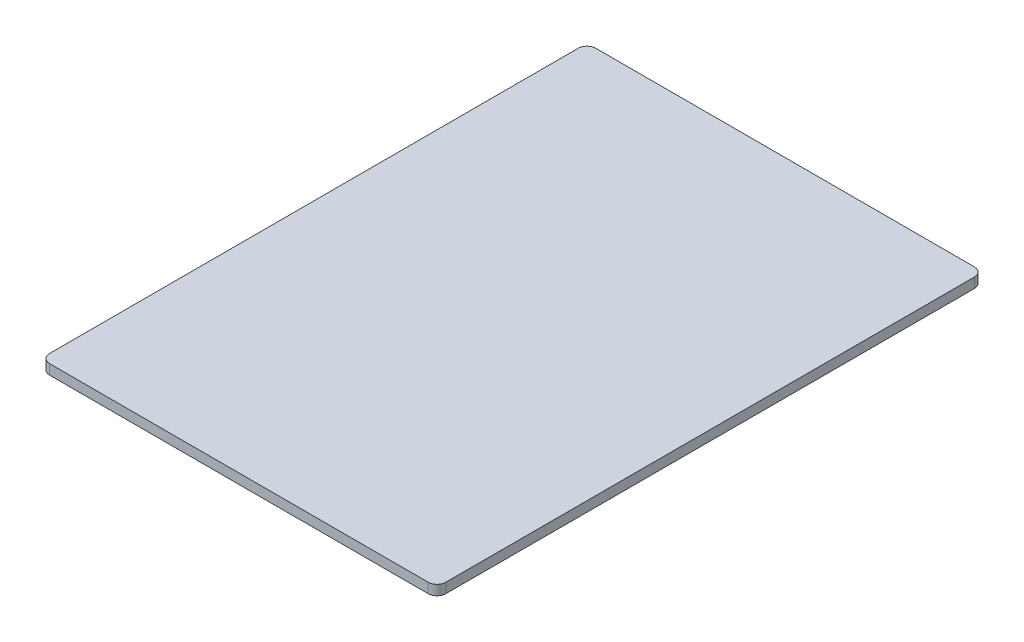
ISO-10303-21;
HEADER;
FILE_DESCRIPTION(('STEP AP214'),'2;1');
FILE_NAME('part.step','',(''),(''),'','','');
FILE_SCHEMA(('AUTOMOTIVE_DESIGN { 1 0 10303 214 1 1 1 1 }'));
ENDSEC;
DATA;
#1=APPLICATION_CONTEXT('core data for automotive mechanical design processes');
#2=APPLICATION_PROTOCOL_DEFINITION('international standard','automotive_design',2000,#1);
#3=PRODUCT_CONTEXT('',#1,'mechanical');
#4=PRODUCT('Part','Part','',(#3));
#5=PRODUCT_RELATED_PRODUCT_CATEGORY('part','',(#4));
#6=PRODUCT_DEFINITION_FORMATION('','',#4);
#7=PRODUCT_DEFINITION_CONTEXT('part definition',#1,'design');
#8=PRODUCT_DEFINITION('design','',#6,#7);
#9=PRODUCT_DEFINITION_SHAPE('','',#8);
#10=(LENGTH_UNIT() NAMED_UNIT(*) SI_UNIT(.MILLI.,.METRE.));
#11=(NAMED_UNIT(*) PLANE_ANGLE_UNIT() SI_UNIT($,.RADIAN.));
#12=(NAMED_UNIT(*) SI_UNIT($,.STERADIAN.) SOLID_ANGLE_UNIT());
#13=UNCERTAINTY_MEASURE_WITH_UNIT(LENGTH_MEASURE(1.E-05),#10,'distance_accuracy_value','');
#14=(GEOMETRIC_REPRESENTATION_CONTEXT(3) GLOBAL_UNCERTAINTY_ASSIGNED_CONTEXT((#13)) GLOBAL_UNIT_ASSIGNED_CONTEXT((#10,
#11,#12)) REPRESENTATION_CONTEXT('',''));
#15=CARTESIAN_POINT('',(0.,0.,0.));
#16=DIRECTION('',(0.,0.,1.));
#17=DIRECTION('',(1.,0.,0.));
#18=AXIS2_PLACEMENT_3D('',#15,#16,#17);
#19=CARTESIAN_POINT('',(0.,0.,0.));
#20=DIRECTION('',(0.,1.,0.));
#21=DIRECTION('',(0.,0.,1.));
#22=AXIS2_PLACEMENT_3D('',#19,#20,#21);
#23=PLANE('',#22);
#24=DIRECTION('',(1.,0.,0.));
#25=VECTOR('',#24,1.);
#26=CARTESIAN_POINT('',(-24.056923076923,0.,45.0960576923077));
#27=LINE('',#26,#25);
#28=CARTESIAN_POINT('',(-23.056923076923,0.,45.0960576923077));
#29=VERTEX_POINT('',#28);
#30=CARTESIAN_POINT('',(19.6630769230769,0.,45.0960576923077));
#31=VERTEX_POINT('',#30);
#32=EDGE_CURVE('E151',#29,#31,#27,.T.);
#33=ORIENTED_EDGE('',*,*,#32,.F.);
#34=CARTESIAN_POINT('',(-23.056923076923,0.,44.0960576923077));
#35=DIRECTION('',(0.,1.,0.));
#36=DIRECTION('',(0.,0.,1.));
#37=AXIS2_PLACEMENT_3D('',#34,#35,#36);
#38=CIRCLE('',#37,1.);
#39=CARTESIAN_POINT('',(-24.056923076923,0.,44.0960576923077));
#40=VERTEX_POINT('',#39);
#41=EDGE_CURVE('E188',#29,#40,#38,.F.);
#42=ORIENTED_EDGE('',*,*,#41,.T.);
#43=DIRECTION('',(0.,0.,1.));
#44=VECTOR('',#43,1.);
#45=CARTESIAN_POINT('',(-24.0569230769231,0.,-16.5539423076923));
#46=LINE('',#45,#44);
#47=CARTESIAN_POINT('',(-24.0569230769231,0.,-15.5539423076923));
#48=VERTEX_POINT('',#47);
#49=EDGE_CURVE('E148',#48,#40,#46,.T.);
#50=ORIENTED_EDGE('',*,*,#49,.F.);
#51=CARTESIAN_POINT('',(-23.0569230769231,0.,-15.5539423076923));
#52=DIRECTION('',(0.,1.,0.));
#53=DIRECTION('',(0.,0.,1.));
#54=AXIS2_PLACEMENT_3D('',#51,#52,#53);
#55=CIRCLE('',#54,1.);
#56=CARTESIAN_POINT('',(-23.0569230769231,0.,-16.5539423076923));
#57=VERTEX_POINT('',#56);
#58=EDGE_CURVE('E182',#48,#57,#55,.F.);
#59=ORIENTED_EDGE('',*,*,#58,.T.);
#60=DIRECTION('',(-1.,0.,0.));
#61=VECTOR('',#60,1.);
#62=CARTESIAN_POINT('',(-24.0569230769231,0.,-16.5539423076923));
#63=LINE('',#62,#61);
#64=CARTESIAN_POINT('',(19.6630769230769,0.,-16.5539423076923));
#65=VERTEX_POINT('',#64);
#66=EDGE_CURVE('E161',#65,#57,#63,.T.);
#67=ORIENTED_EDGE('',*,*,#66,.F.);
#68=CARTESIAN_POINT('',(19.6630769230769,0.,-15.5539423076923));
#69=DIRECTION('',(0.,1.,0.));
#70=DIRECTION('',(0.,0.,1.));
#71=AXIS2_PLACEMENT_3D('',#68,#69,#70);
#72=CIRCLE('',#71,1.);
#73=CARTESIAN_POINT('',(20.6630769230769,0.,-15.5539423076923));
#74=VERTEX_POINT('',#73);
#75=EDGE_CURVE('E184',#65,#74,#72,.F.);
#76=ORIENTED_EDGE('',*,*,#75,.T.);
#77=DIRECTION('',(0.,0.,-1.));
#78=VECTOR('',#77,1.);
#79=CARTESIAN_POINT('',(20.6630769230769,0.,-16.5539423076923));
#80=LINE('',#79,#78);
#81=CARTESIAN_POINT('',(20.6630769230769,0.,44.0960576923077));
#82=VERTEX_POINT('',#81);
#83=EDGE_CURVE('E173',#82,#74,#80,.T.);
#84=ORIENTED_EDGE('',*,*,#83,.F.);
#85=CARTESIAN_POINT('',(19.6630769230769,0.,44.0960576923077));
#86=DIRECTION('',(0.,1.,0.));
#87=DIRECTION('',(0.,0.,1.));
#88=AXIS2_PLACEMENT_3D('',#85,#86,#87);
#89=CIRCLE('',#88,1.);
#90=EDGE_CURVE('E186',#82,#31,#89,.F.);
#91=ORIENTED_EDGE('',*,*,#90,.T.);
#92=EDGE_LOOP('',(#33,#42,#50,#59,#67,#76,#84,#91));
#93=FACE_BOUND('',#92,.T.);
#94=DIRECTION('',(0.,0.,-1.));
#95=VECTOR('',#94,1.);
#96=CARTESIAN_POINT('',(-20.3069230769231,0.,39.5560576923077));
#97=LINE('',#96,#95);
#98=CARTESIAN_POINT('',(-20.3069230769231,0.,39.5560576923077));
#99=VERTEX_POINT('',#98);
#100=CARTESIAN_POINT('',(-20.306923076923,0.,-10.0939423076923));
#101=VERTEX_POINT('',#100);
#102=EDGE_CURVE('E54',#99,#101,#97,.T.);
#103=ORIENTED_EDGE('',*,*,#102,.F.);
#104=DIRECTION('',(-1.,0.,0.));
#105=VECTOR('',#104,1.);
#106=CARTESIAN_POINT('',(-20.3069230769231,0.,39.5560576923077));
#107=LINE('',#106,#105);
#108=CARTESIAN_POINT('',(16.9130769230769,0.,39.5560576923077));
#109=VERTEX_POINT('',#108);
#110=EDGE_CURVE('E58',#109,#99,#107,.T.);
#111=ORIENTED_EDGE('',*,*,#110,.F.);
#112=DIRECTION('',(0.,0.,1.));
#113=VECTOR('',#112,1.);
#114=CARTESIAN_POINT('',(16.9130769230769,0.,39.5560576923077));
#115=LINE('',#114,#113);
#116=CARTESIAN_POINT('',(16.9130769230769,0.,-10.0939423076923));
#117=VERTEX_POINT('',#116);
#118=EDGE_CURVE('E398',#117,#109,#115,.T.);
#119=ORIENTED_EDGE('',*,*,#118,.F.);
#120=DIRECTION('',(1.,0.,0.));
#121=VECTOR('',#120,1.);
#122=CARTESIAN_POINT('',(-20.306923076923,0.,-10.0939423076923));
#123=LINE('',#122,#121);
#124=EDGE_CURVE('E404',#101,#117,#123,.T.);
#125=ORIENTED_EDGE('',*,*,#124,.F.);
#126=EDGE_LOOP('',(#103,#111,#119,#125));
#127=FACE_BOUND('',#126,.T.);
#128=ADVANCED_FACE('F39',(#93,#127),#23,.F.);
#129=CARTESIAN_POINT('',(-24.0569230769231,1.125,-16.5539423076923));
#130=DIRECTION('',(1.,0.,0.));
#131=DIRECTION('',(0.,0.,-1.));
#132=AXIS2_PLACEMENT_3D('',#129,#130,#131);
#133=PLANE('',#132);
#134=ORIENTED_EDGE('',*,*,#49,.T.);
#135=DIRECTION('',(0.,-1.,0.));
#136=VECTOR('',#135,1.);
#137=CARTESIAN_POINT('',(-24.056923076923,1.125,44.0960576923077));
#138=LINE('',#137,#136);
#139=CARTESIAN_POINT('',(-24.056923076923,1.125,44.0960576923077));
#140=VERTEX_POINT('',#139);
#141=EDGE_CURVE('E193',#40,#140,#138,.F.);
#142=ORIENTED_EDGE('',*,*,#141,.T.);
#143=DIRECTION('',(0.,0.,1.));
#144=VECTOR('',#143,1.);
#145=CARTESIAN_POINT('',(-24.0569230769231,1.125,-16.5539423076923));
#146=LINE('',#145,#144);
#147=CARTESIAN_POINT('',(-24.0569230769231,1.125,-15.5539423076923));
#148=VERTEX_POINT('',#147);
#149=EDGE_CURVE('E157',#148,#140,#146,.T.);
#150=ORIENTED_EDGE('',*,*,#149,.F.);
#151=DIRECTION('',(0.,-1.,0.));
#152=VECTOR('',#151,1.);
#153=CARTESIAN_POINT('',(-24.0569230769231,1.125,-15.5539423076923));
#154=LINE('',#153,#152);
#155=EDGE_CURVE('E190',#148,#48,#154,.T.);
#156=ORIENTED_EDGE('',*,*,#155,.T.);
#157=EDGE_LOOP('',(#134,#142,#150,#156));
#158=FACE_BOUND('',#157,.T.);
#159=ADVANCED_FACE('F222',(#158),#133,.F.);
#160=CARTESIAN_POINT('',(-24.056923076923,1.125,45.0960576923077));
#161=DIRECTION('',(0.,0.,-1.));
#162=DIRECTION('',(-1.,0.,0.));
#163=AXIS2_PLACEMENT_3D('',#160,#161,#162);
#164=PLANE('',#163);
#165=DIRECTION('',(1.,0.,0.));
#166=VECTOR('',#165,1.);
#167=CARTESIAN_POINT('',(-24.056923076923,1.125,45.0960576923077));
#168=LINE('',#167,#166);
#169=CARTESIAN_POINT('',(-23.056923076923,1.125,45.0960576923077));
#170=VERTEX_POINT('',#169);
#171=CARTESIAN_POINT('',(19.6630769230769,1.125,45.0960576923077));
#172=VERTEX_POINT('',#171);
#173=EDGE_CURVE('E160',#170,#172,#168,.T.);
#174=ORIENTED_EDGE('',*,*,#173,.F.);
#175=DIRECTION('',(0.,-1.,0.));
#176=VECTOR('',#175,1.);
#177=CARTESIAN_POINT('',(-23.056923076923,1.125,45.0960576923077));
#178=LINE('',#177,#176);
#179=EDGE_CURVE('E179',#170,#29,#178,.T.);
#180=ORIENTED_EDGE('',*,*,#179,.T.);
#181=ORIENTED_EDGE('',*,*,#32,.T.);
#182=DIRECTION('',(0.,-1.,0.));
#183=VECTOR('',#182,1.);
#184=CARTESIAN_POINT('',(19.6630769230769,1.125,45.0960576923077));
#185=LINE('',#184,#183);
#186=EDGE_CURVE('E169',#31,#172,#185,.F.);
#187=ORIENTED_EDGE('',*,*,#186,.T.);
#188=EDGE_LOOP('',(#174,#180,#181,#187));
#189=FACE_BOUND('',#188,.T.);
#190=ADVANCED_FACE('F232',(#189),#164,.F.);
#191=CARTESIAN_POINT('',(20.6630769230769,1.125,-16.5539423076923));
#192=DIRECTION('',(-1.,0.,0.));
#193=DIRECTION('',(0.,0.,1.));
#194=AXIS2_PLACEMENT_3D('',#191,#192,#193);
#195=PLANE('',#194);
#196=DIRECTION('',(0.,0.,-1.));
#197=VECTOR('',#196,1.);
#198=CARTESIAN_POINT('',(20.6630769230769,1.125,-16.5539423076923));
#199=LINE('',#198,#197);
#200=CARTESIAN_POINT('',(20.6630769230769,1.125,44.0960576923077));
#201=VERTEX_POINT('',#200);
#202=CARTESIAN_POINT('',(20.6630769230769,1.125,-15.5539423076923));
#203=VERTEX_POINT('',#202);
#204=EDGE_CURVE('E164',#201,#203,#199,.T.);
#205=ORIENTED_EDGE('',*,*,#204,.F.);
#206=DIRECTION('',(0.,-1.,0.));
#207=VECTOR('',#206,1.);
#208=CARTESIAN_POINT('',(20.6630769230769,1.125,44.0960576923077));
#209=LINE('',#208,#207);
#210=EDGE_CURVE('E205',#201,#82,#209,.T.);
#211=ORIENTED_EDGE('',*,*,#210,.T.);
#212=ORIENTED_EDGE('',*,*,#83,.T.);
#213=DIRECTION('',(0.,-1.,0.));
#214=VECTOR('',#213,1.);
#215=CARTESIAN_POINT('',(20.6630769230769,1.125,-15.5539423076923));
#216=LINE('',#215,#214);
#217=EDGE_CURVE('E203',#74,#203,#216,.F.);
#218=ORIENTED_EDGE('',*,*,#217,.T.);
#219=EDGE_LOOP('',(#205,#211,#212,#218));
#220=FACE_BOUND('',#219,.T.);
#221=ADVANCED_FACE('F241',(#220),#195,.F.);
#222=CARTESIAN_POINT('',(-24.0569230769231,1.125,-16.5539423076923));
#223=DIRECTION('',(0.,0.,1.));
#224=DIRECTION('',(1.,0.,0.));
#225=AXIS2_PLACEMENT_3D('',#222,#223,#224);
#226=PLANE('',#225);
#227=DIRECTION('',(-1.,0.,0.));
#228=VECTOR('',#227,1.);
#229=CARTESIAN_POINT('',(-24.0569230769231,1.125,-16.5539423076923));
#230=LINE('',#229,#228);
#231=CARTESIAN_POINT('',(19.6630769230769,1.125,-16.5539423076923));
#232=VERTEX_POINT('',#231);
#233=CARTESIAN_POINT('',(-23.0569230769231,1.125,-16.5539423076923));
#234=VERTEX_POINT('',#233);
#235=EDGE_CURVE('E167',#232,#234,#230,.T.);
#236=ORIENTED_EDGE('',*,*,#235,.F.);
#237=DIRECTION('',(0.,-1.,0.));
#238=VECTOR('',#237,1.);
#239=CARTESIAN_POINT('',(19.6630769230769,1.125,-16.5539423076923));
#240=LINE('',#239,#238);
#241=EDGE_CURVE('E11',#232,#65,#240,.T.);
#242=ORIENTED_EDGE('',*,*,#241,.T.);
#243=ORIENTED_EDGE('',*,*,#66,.T.);
#244=DIRECTION('',(0.,-1.,0.));
#245=VECTOR('',#244,1.);
#246=CARTESIAN_POINT('',(-23.0569230769231,1.125,-16.5539423076923));
#247=LINE('',#246,#245);
#248=EDGE_CURVE('E47',#57,#234,#247,.F.);
#249=ORIENTED_EDGE('',*,*,#248,.T.);
#250=EDGE_LOOP('',(#236,#242,#243,#249));
#251=FACE_BOUND('',#250,.T.);
#252=ADVANCED_FACE('F210',(#251),#226,.F.);
#253=CARTESIAN_POINT('',(0.,1.125,0.));
#254=DIRECTION('',(0.,1.,0.));
#255=DIRECTION('',(0.,0.,1.));
#256=AXIS2_PLACEMENT_3D('',#253,#254,#255);
#257=PLANE('',#256);
#258=ORIENTED_EDGE('',*,*,#149,.T.);
#259=CARTESIAN_POINT('',(-23.056923076923,1.125,44.0960576923077));
#260=DIRECTION('',(0.,1.,0.));
#261=DIRECTION('',(0.,0.,1.));
#262=AXIS2_PLACEMENT_3D('',#259,#260,#261);
#263=CIRCLE('',#262,1.);
#264=EDGE_CURVE('E201',#140,#170,#263,.T.);
#265=ORIENTED_EDGE('',*,*,#264,.T.);
#266=ORIENTED_EDGE('',*,*,#173,.T.);
#267=CARTESIAN_POINT('',(19.6630769230769,1.125,44.0960576923077));
#268=DIRECTION('',(0.,1.,0.));
#269=DIRECTION('',(0.,0.,1.));
#270=AXIS2_PLACEMENT_3D('',#267,#268,#269);
#271=CIRCLE('',#270,1.);
#272=EDGE_CURVE('E199',#172,#201,#271,.T.);
#273=ORIENTED_EDGE('',*,*,#272,.T.);
#274=ORIENTED_EDGE('',*,*,#204,.T.);
#275=CARTESIAN_POINT('',(19.6630769230769,1.125,-15.5539423076923));
#276=DIRECTION('',(0.,1.,0.));
#277=DIRECTION('',(0.,0.,1.));
#278=AXIS2_PLACEMENT_3D('',#275,#276,#277);
#279=CIRCLE('',#278,1.);
#280=EDGE_CURVE('E197',#203,#232,#279,.T.);
#281=ORIENTED_EDGE('',*,*,#280,.T.);
#282=ORIENTED_EDGE('',*,*,#235,.T.);
#283=CARTESIAN_POINT('',(-23.0569230769231,1.125,-15.5539423076923));
#284=DIRECTION('',(0.,1.,0.));
#285=DIRECTION('',(0.,0.,1.));
#286=AXIS2_PLACEMENT_3D('',#283,#284,#285);
#287=CIRCLE('',#286,1.);
#288=EDGE_CURVE('E195',#234,#148,#287,.T.);
#289=ORIENTED_EDGE('',*,*,#288,.T.);
#290=EDGE_LOOP('',(#258,#265,#266,#273,#274,#281,#282,#289));
#291=FACE_BOUND('',#290,.T.);
#292=ADVANCED_FACE('F216',(#291),#257,.T.);
#293=CARTESIAN_POINT('',(-23.056923076923,1.125,44.0960576923077));
#294=DIRECTION('',(0.,-1.,0.));
#295=DIRECTION('',(0.,0.,-1.));
#296=AXIS2_PLACEMENT_3D('',#293,#294,#295);
#297=CYLINDRICAL_SURFACE('',#296,1.);
#298=ORIENTED_EDGE('',*,*,#264,.F.);
#299=ORIENTED_EDGE('',*,*,#141,.F.);
#300=ORIENTED_EDGE('',*,*,#41,.F.);
#301=ORIENTED_EDGE('',*,*,#179,.F.);
#302=EDGE_LOOP('',(#298,#299,#300,#301));
#303=FACE_BOUND('',#302,.T.);
#304=ADVANCED_FACE('F229',(#303),#297,.T.);
#305=CARTESIAN_POINT('',(19.6630769230769,1.125,44.0960576923077));
#306=DIRECTION('',(0.,-1.,0.));
#307=DIRECTION('',(0.,0.,-1.));
#308=AXIS2_PLACEMENT_3D('',#305,#306,#307);
#309=CYLINDRICAL_SURFACE('',#308,1.);
#310=ORIENTED_EDGE('',*,*,#272,.F.);
#311=ORIENTED_EDGE('',*,*,#186,.F.);
#312=ORIENTED_EDGE('',*,*,#90,.F.);
#313=ORIENTED_EDGE('',*,*,#210,.F.);
#314=EDGE_LOOP('',(#310,#311,#312,#313));
#315=FACE_BOUND('',#314,.T.);
#316=ADVANCED_FACE('F238',(#315),#309,.T.);
#317=CARTESIAN_POINT('',(19.6630769230769,1.125,-15.5539423076923));
#318=DIRECTION('',(0.,-1.,0.));
#319=DIRECTION('',(0.,0.,-1.));
#320=AXIS2_PLACEMENT_3D('',#317,#318,#319);
#321=CYLINDRICAL_SURFACE('',#320,1.);
#322=ORIENTED_EDGE('',*,*,#280,.F.);
#323=ORIENTED_EDGE('',*,*,#217,.F.);
#324=ORIENTED_EDGE('',*,*,#75,.F.);
#325=ORIENTED_EDGE('',*,*,#241,.F.);
#326=EDGE_LOOP('',(#322,#323,#324,#325));
#327=FACE_BOUND('',#326,.T.);
#328=ADVANCED_FACE('F244',(#327),#321,.T.);
#329=CARTESIAN_POINT('',(-23.0569230769231,1.125,-15.5539423076923));
#330=DIRECTION('',(0.,-1.,0.));
#331=DIRECTION('',(0.,0.,-1.));
#332=AXIS2_PLACEMENT_3D('',#329,#330,#331);
#333=CYLINDRICAL_SURFACE('',#332,1.);
#334=ORIENTED_EDGE('',*,*,#288,.F.);
#335=ORIENTED_EDGE('',*,*,#248,.F.);
#336=ORIENTED_EDGE('',*,*,#58,.F.);
#337=ORIENTED_EDGE('',*,*,#155,.F.);
#338=EDGE_LOOP('',(#334,#335,#336,#337));
#339=FACE_BOUND('',#338,.T.);
#340=ADVANCED_FACE('F41',(#339),#333,.T.);
#341=CARTESIAN_POINT('',(-20.3069230769231,-0.78,39.5560576923077));
#342=DIRECTION('',(1.,0.,0.));
#343=DIRECTION('',(0.,0.,-1.));
#344=AXIS2_PLACEMENT_3D('',#341,#342,#343);
#345=PLANE('',#344);
#346=ORIENTED_EDGE('',*,*,#102,.T.);
#347=DIRECTION('',(0.,1.,0.));
#348=VECTOR('',#347,1.);
#349=CARTESIAN_POINT('',(-20.306923076923,-0.78,-10.0939423076923));
#350=LINE('',#349,#348);
#351=CARTESIAN_POINT('',(-20.306923076923,-0.78,-10.0939423076923));
#352=VERTEX_POINT('',#351);
#353=EDGE_CURVE('E131',#352,#101,#350,.T.);
#354=ORIENTED_EDGE('',*,*,#353,.F.);
#355=DIRECTION('',(0.,0.,-1.));
#356=VECTOR('',#355,1.);
#357=CARTESIAN_POINT('',(-20.3069230769231,-0.78,39.5560576923077));
#358=LINE('',#357,#356);
#359=CARTESIAN_POINT('',(-20.3069230769231,-0.78,39.5560576923077));
#360=VERTEX_POINT('',#359);
#361=EDGE_CURVE('E137',#360,#352,#358,.T.);
#362=ORIENTED_EDGE('',*,*,#361,.F.);
#363=DIRECTION('',(0.,1.,0.));
#364=VECTOR('',#363,1.);
#365=CARTESIAN_POINT('',(-20.3069230769231,-0.78,39.5560576923077));
#366=LINE('',#365,#364);
#367=EDGE_CURVE('E396',#360,#99,#366,.T.);
#368=ORIENTED_EDGE('',*,*,#367,.T.);
#369=EDGE_LOOP('',(#346,#354,#362,#368));
#370=FACE_BOUND('',#369,.T.);
#371=ADVANCED_FACE('F147',(#370),#345,.F.);
#372=CARTESIAN_POINT('',(-20.306923076923,-0.78,-10.0939423076923));
#373=DIRECTION('',(0.,0.,1.));
#374=DIRECTION('',(1.,0.,0.));
#375=AXIS2_PLACEMENT_3D('',#372,#373,#374);
#376=PLANE('',#375);
#377=ORIENTED_EDGE('',*,*,#124,.T.);
#378=DIRECTION('',(0.,1.,0.));
#379=VECTOR('',#378,1.);
#380=CARTESIAN_POINT('',(16.9130769230769,-0.78,-10.0939423076923));
#381=LINE('',#380,#379);
#382=CARTESIAN_POINT('',(16.9130769230769,-0.78,-10.0939423076923));
#383=VERTEX_POINT('',#382);
#384=EDGE_CURVE('E133',#383,#117,#381,.T.);
#385=ORIENTED_EDGE('',*,*,#384,.F.);
#386=DIRECTION('',(1.,0.,0.));
#387=VECTOR('',#386,1.);
#388=CARTESIAN_POINT('',(-20.306923076923,-0.78,-10.0939423076923));
#389=LINE('',#388,#387);
#390=EDGE_CURVE('E126',#352,#383,#389,.T.);
#391=ORIENTED_EDGE('',*,*,#390,.F.);
#392=ORIENTED_EDGE('',*,*,#353,.T.);
#393=EDGE_LOOP('',(#377,#385,#391,#392));
#394=FACE_BOUND('',#393,.T.);
#395=ADVANCED_FACE('F129',(#394),#376,.F.);
#396=CARTESIAN_POINT('',(16.9130769230769,-0.78,39.5560576923077));
#397=DIRECTION('',(-1.,0.,0.));
#398=DIRECTION('',(0.,0.,1.));
#399=AXIS2_PLACEMENT_3D('',#396,#397,#398);
#400=PLANE('',#399);
#401=ORIENTED_EDGE('',*,*,#118,.T.);
#402=DIRECTION('',(0.,1.,0.));
#403=VECTOR('',#402,1.);
#404=CARTESIAN_POINT('',(16.9130769230769,-0.78,39.5560576923077));
#405=LINE('',#404,#403);
#406=CARTESIAN_POINT('',(16.9130769230769,-0.78,39.5560576923077));
#407=VERTEX_POINT('',#406);
#408=EDGE_CURVE('E153',#407,#109,#405,.T.);
#409=ORIENTED_EDGE('',*,*,#408,.F.);
#410=DIRECTION('',(0.,0.,1.));
#411=VECTOR('',#410,1.);
#412=CARTESIAN_POINT('',(16.9130769230769,-0.78,39.5560576923077));
#413=LINE('',#412,#411);
#414=EDGE_CURVE('E136',#383,#407,#413,.T.);
#415=ORIENTED_EDGE('',*,*,#414,.F.);
#416=ORIENTED_EDGE('',*,*,#384,.T.);
#417=EDGE_LOOP('',(#401,#409,#415,#416));
#418=FACE_BOUND('',#417,.T.);
#419=ADVANCED_FACE('F356',(#418),#400,.F.);
#420=CARTESIAN_POINT('',(-20.3069230769231,-0.78,39.5560576923077));
#421=DIRECTION('',(0.,0.,-1.));
#422=DIRECTION('',(-1.,0.,0.));
#423=AXIS2_PLACEMENT_3D('',#420,#421,#422);
#424=PLANE('',#423);
#425=ORIENTED_EDGE('',*,*,#110,.T.);
#426=ORIENTED_EDGE('',*,*,#367,.F.);
#427=DIRECTION('',(-1.,0.,0.));
#428=VECTOR('',#427,1.);
#429=CARTESIAN_POINT('',(-20.3069230769231,-0.78,39.5560576923077));
#430=LINE('',#429,#428);
#431=EDGE_CURVE('E142',#407,#360,#430,.T.);
#432=ORIENTED_EDGE('',*,*,#431,.F.);
#433=ORIENTED_EDGE('',*,*,#408,.T.);
#434=EDGE_LOOP('',(#425,#426,#432,#433));
#435=FACE_BOUND('',#434,.T.);
#436=ADVANCED_FACE('F366',(#435),#424,.F.);
#437=CARTESIAN_POINT('',(0.,-0.78,0.));
#438=DIRECTION('',(0.,-1.,0.));
#439=DIRECTION('',(0.,0.,-1.));
#440=AXIS2_PLACEMENT_3D('',#437,#438,#439);
#441=PLANE('',#440);
#442=ORIENTED_EDGE('',*,*,#361,.T.);
#443=ORIENTED_EDGE('',*,*,#390,.T.);
#444=ORIENTED_EDGE('',*,*,#414,.T.);
#445=ORIENTED_EDGE('',*,*,#431,.T.);
#446=EDGE_LOOP('',(#442,#443,#444,#445));
#447=FACE_BOUND('',#446,.T.);
#448=ADVANCED_FACE('F140',(#447),#441,.T.);
#449=CLOSED_SHELL('',(#128,#159,#190,#221,#252,#292,#304,#316,#328,#340,#371,#395,#419,#436,#448));
#450=MANIFOLD_SOLID_BREP('B2',#449);
#451=ADVANCED_BREP_SHAPE_REPRESENTATION('',(#18,#450),#14);
#452=SHAPE_DEFINITION_REPRESENTATION(#9,#451);
ENDSEC;
END-ISO-10303-21;
